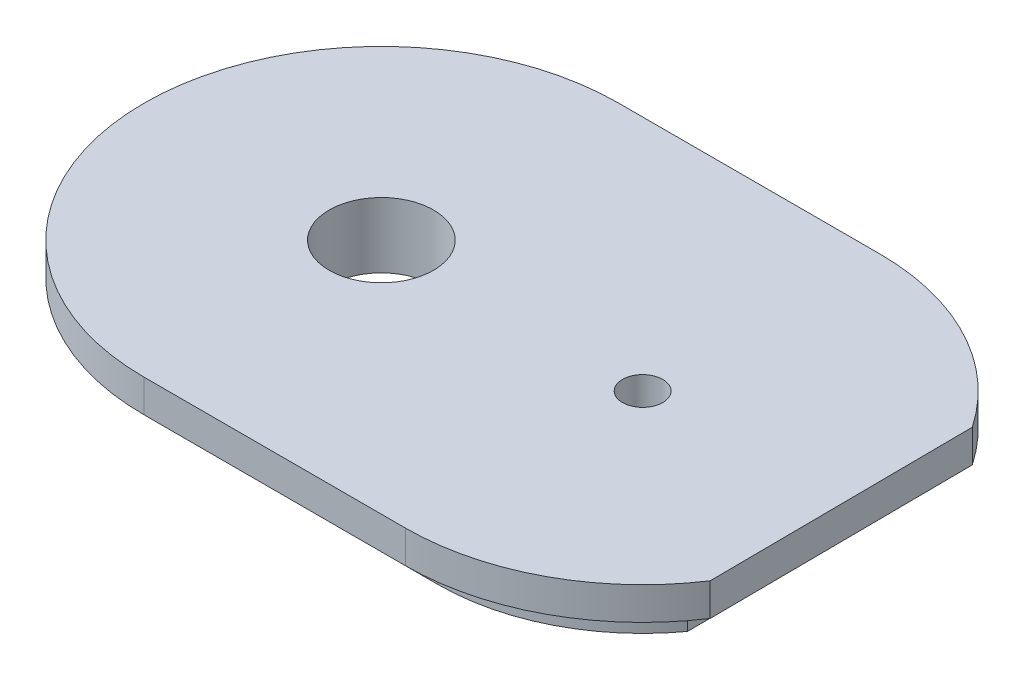
ISO-10303-21;
HEADER;
FILE_DESCRIPTION(('STEP AP214'),'2;1');
FILE_NAME('part.step','',(''),(''),'','','');
FILE_SCHEMA(('AUTOMOTIVE_DESIGN { 1 0 10303 214 1 1 1 1 }'));
ENDSEC;
DATA;
#1=APPLICATION_CONTEXT('core data for automotive mechanical design processes');
#2=APPLICATION_PROTOCOL_DEFINITION('international standard','automotive_design',2000,#1);
#3=PRODUCT_CONTEXT('',#1,'mechanical');
#4=PRODUCT('Part','Part','',(#3));
#5=PRODUCT_RELATED_PRODUCT_CATEGORY('part','',(#4));
#6=PRODUCT_DEFINITION_FORMATION('','',#4);
#7=PRODUCT_DEFINITION_CONTEXT('part definition',#1,'design');
#8=PRODUCT_DEFINITION('design','',#6,#7);
#9=PRODUCT_DEFINITION_SHAPE('','',#8);
#10=(LENGTH_UNIT() NAMED_UNIT(*) SI_UNIT(.MILLI.,.METRE.));
#11=(NAMED_UNIT(*) PLANE_ANGLE_UNIT() SI_UNIT($,.RADIAN.));
#12=(NAMED_UNIT(*) SI_UNIT($,.STERADIAN.) SOLID_ANGLE_UNIT());
#13=UNCERTAINTY_MEASURE_WITH_UNIT(LENGTH_MEASURE(1.E-05),#10,'distance_accuracy_value','');
#14=(GEOMETRIC_REPRESENTATION_CONTEXT(3) GLOBAL_UNCERTAINTY_ASSIGNED_CONTEXT((#13)) GLOBAL_UNIT_ASSIGNED_CONTEXT((#10,
#11,#12)) REPRESENTATION_CONTEXT('',''));
#15=CARTESIAN_POINT('',(0.,0.,0.));
#16=DIRECTION('',(0.,0.,1.));
#17=DIRECTION('',(1.,0.,0.));
#18=AXIS2_PLACEMENT_3D('',#15,#16,#17);
#19=CARTESIAN_POINT('',(-4.2390836204506,-1.25,-7.83579325082316));
#20=DIRECTION('',(0.,0.,-1.));
#21=DIRECTION('',(-1.,0.,0.));
#22=AXIS2_PLACEMENT_3D('',#19,#20,#21);
#23=PLANE('',#22);
#24=DIRECTION('',(-1.,0.,0.));
#25=VECTOR('',#24,1.);
#26=CARTESIAN_POINT('',(-4.2390836204506,0.,-7.83579325082316));
#27=LINE('',#26,#25);
#28=CARTESIAN_POINT('',(-4.2390836204506,0.,-7.83579325082316));
#29=VERTEX_POINT('',#28);
#30=CARTESIAN_POINT('',(-14.2421395949664,0.,-7.83579325082316));
#31=VERTEX_POINT('',#30);
#32=EDGE_CURVE('E202',#29,#31,#27,.T.);
#33=ORIENTED_EDGE('',*,*,#32,.F.);
#34=DIRECTION('',(0.,1.,0.));
#35=VECTOR('',#34,1.);
#36=CARTESIAN_POINT('',(-4.2390836204506,-1.25,-7.83579325082316));
#37=LINE('',#36,#35);
#38=CARTESIAN_POINT('',(-4.2390836204506,-1.25,-7.83579325082316));
#39=VERTEX_POINT('',#38);
#40=EDGE_CURVE('E12',#39,#29,#37,.T.);
#41=ORIENTED_EDGE('',*,*,#40,.F.);
#42=DIRECTION('',(-1.,0.,0.));
#43=VECTOR('',#42,1.);
#44=CARTESIAN_POINT('',(-4.2390836204506,-1.25,-7.83579325082316));
#45=LINE('',#44,#43);
#46=CARTESIAN_POINT('',(-14.2421395949664,-1.25,-7.83579325082316));
#47=VERTEX_POINT('',#46);
#48=EDGE_CURVE('E217',#39,#47,#45,.T.);
#49=ORIENTED_EDGE('',*,*,#48,.T.);
#50=DIRECTION('',(0.,1.,0.));
#51=VECTOR('',#50,1.);
#52=CARTESIAN_POINT('',(-14.2421395949664,-1.25,-7.83579325082316));
#53=LINE('',#52,#51);
#54=EDGE_CURVE('E120',#47,#31,#53,.T.);
#55=ORIENTED_EDGE('',*,*,#54,.T.);
#56=EDGE_LOOP('',(#33,#41,#49,#55));
#57=FACE_BOUND('',#56,.T.);
#58=ADVANCED_FACE('F117',(#57),#23,.T.);
#59=CARTESIAN_POINT('',(-4.2390836204506,-1.25,0.));
#60=DIRECTION('',(0.,1.,0.));
#61=DIRECTION('',(0.,0.,1.));
#62=AXIS2_PLACEMENT_3D('',#59,#60,#61);
#63=CYLINDRICAL_SURFACE('',#62,7.83579325082316);
#64=CARTESIAN_POINT('',(-4.2390836204506,0.,0.));
#65=DIRECTION('',(0.,1.,0.));
#66=DIRECTION('',(0.,0.,1.));
#67=AXIS2_PLACEMENT_3D('',#64,#65,#66);
#68=CIRCLE('',#67,7.83579325082316);
#69=CARTESIAN_POINT('',(2.02635285261106,0.,-4.70573710184435));
#70=VERTEX_POINT('',#69);
#71=EDGE_CURVE('E215',#70,#29,#68,.T.);
#72=ORIENTED_EDGE('',*,*,#71,.F.);
#73=DIRECTION('',(0.,1.,0.));
#74=VECTOR('',#73,1.);
#75=CARTESIAN_POINT('',(2.02635285261106,-1.25,-4.70573710184435));
#76=LINE('',#75,#74);
#77=CARTESIAN_POINT('',(2.02635285261106,-1.25,-4.70573710184435));
#78=VERTEX_POINT('',#77);
#79=EDGE_CURVE('E126',#78,#70,#76,.T.);
#80=ORIENTED_EDGE('',*,*,#79,.F.);
#81=CARTESIAN_POINT('',(-4.2390836204506,-1.25,0.));
#82=DIRECTION('',(0.,1.,0.));
#83=DIRECTION('',(0.,0.,1.));
#84=AXIS2_PLACEMENT_3D('',#81,#82,#83);
#85=CIRCLE('',#84,7.83579325082316);
#86=EDGE_CURVE('E192',#78,#39,#85,.T.);
#87=ORIENTED_EDGE('',*,*,#86,.T.);
#88=ORIENTED_EDGE('',*,*,#40,.T.);
#89=EDGE_LOOP('',(#72,#80,#87,#88));
#90=FACE_BOUND('',#89,.T.);
#91=ADVANCED_FACE('F228',(#90),#63,.T.);
#92=CARTESIAN_POINT('',(2.09434532245517,-1.25,4.61381985938));
#93=DIRECTION('',(0.999973387616815,0.,-0.00729548203689709));
#94=DIRECTION('',(-0.00729548203689709,0.,-0.999973387616815));
#95=AXIS2_PLACEMENT_3D('',#92,#93,#94);
#96=PLANE('',#95);
#97=DIRECTION('',(-0.00729548203689709,0.,-0.999973387616815));
#98=VECTOR('',#97,1.);
#99=CARTESIAN_POINT('',(2.09434532245517,0.,4.61381985938));
#100=LINE('',#99,#98);
#101=CARTESIAN_POINT('',(2.09434532245517,0.,4.61381985938));
#102=VERTEX_POINT('',#101);
#103=EDGE_CURVE('E181',#102,#70,#100,.T.);
#104=ORIENTED_EDGE('',*,*,#103,.F.);
#105=DIRECTION('',(0.,1.,0.));
#106=VECTOR('',#105,1.);
#107=CARTESIAN_POINT('',(2.09434532245517,-1.25,4.61381985938));
#108=LINE('',#107,#106);
#109=CARTESIAN_POINT('',(2.09434532245517,-1.25,4.61381985938));
#110=VERTEX_POINT('',#109);
#111=EDGE_CURVE('E155',#110,#102,#108,.T.);
#112=ORIENTED_EDGE('',*,*,#111,.F.);
#113=DIRECTION('',(-0.00729548203689709,0.,-0.999973387616815));
#114=VECTOR('',#113,1.);
#115=CARTESIAN_POINT('',(2.09434532245517,-1.25,4.61381985938));
#116=LINE('',#115,#114);
#117=EDGE_CURVE('E178',#110,#78,#116,.T.);
#118=ORIENTED_EDGE('',*,*,#117,.T.);
#119=ORIENTED_EDGE('',*,*,#79,.T.);
#120=EDGE_LOOP('',(#104,#112,#118,#119));
#121=FACE_BOUND('',#120,.T.);
#122=ADVANCED_FACE('F177',(#121),#96,.T.);
#123=CARTESIAN_POINT('',(-4.2390836204506,-1.25,0.));
#124=DIRECTION('',(0.,1.,0.));
#125=DIRECTION('',(0.,0.,1.));
#126=AXIS2_PLACEMENT_3D('',#123,#124,#125);
#127=CYLINDRICAL_SURFACE('',#126,7.83579325082316);
#128=CARTESIAN_POINT('',(-4.2390836204506,0.,0.));
#129=DIRECTION('',(0.,1.,0.));
#130=DIRECTION('',(0.,0.,1.));
#131=AXIS2_PLACEMENT_3D('',#128,#129,#130);
#132=CIRCLE('',#131,7.83579325082316);
#133=CARTESIAN_POINT('',(-4.2390836204506,0.,7.83579325082316));
#134=VERTEX_POINT('',#133);
#135=EDGE_CURVE('E212',#134,#102,#132,.T.);
#136=ORIENTED_EDGE('',*,*,#135,.F.);
#137=DIRECTION('',(0.,1.,0.));
#138=VECTOR('',#137,1.);
#139=CARTESIAN_POINT('',(-4.2390836204506,-1.25,7.83579325082316));
#140=LINE('',#139,#138);
#141=CARTESIAN_POINT('',(-4.2390836204506,-1.25,7.83579325082316));
#142=VERTEX_POINT('',#141);
#143=EDGE_CURVE('E183',#142,#134,#140,.T.);
#144=ORIENTED_EDGE('',*,*,#143,.F.);
#145=CARTESIAN_POINT('',(-4.2390836204506,-1.25,0.));
#146=DIRECTION('',(0.,1.,0.));
#147=DIRECTION('',(0.,0.,1.));
#148=AXIS2_PLACEMENT_3D('',#145,#146,#147);
#149=CIRCLE('',#148,7.83579325082316);
#150=EDGE_CURVE('E189',#142,#110,#149,.T.);
#151=ORIENTED_EDGE('',*,*,#150,.T.);
#152=ORIENTED_EDGE('',*,*,#111,.T.);
#153=EDGE_LOOP('',(#136,#144,#151,#152));
#154=FACE_BOUND('',#153,.T.);
#155=ADVANCED_FACE('F194',(#154),#127,.T.);
#156=CARTESIAN_POINT('',(-14.2421395949664,-1.25,7.83579325082316));
#157=DIRECTION('',(0.,0.,1.));
#158=DIRECTION('',(1.,0.,0.));
#159=AXIS2_PLACEMENT_3D('',#156,#157,#158);
#160=PLANE('',#159);
#161=DIRECTION('',(1.,0.,0.));
#162=VECTOR('',#161,1.);
#163=CARTESIAN_POINT('',(-14.2421395949664,0.,7.83579325082316));
#164=LINE('',#163,#162);
#165=CARTESIAN_POINT('',(-14.2421395949664,0.,7.83579325082316));
#166=VERTEX_POINT('',#165);
#167=EDGE_CURVE('E209',#166,#134,#164,.T.);
#168=ORIENTED_EDGE('',*,*,#167,.F.);
#169=DIRECTION('',(0.,1.,0.));
#170=VECTOR('',#169,1.);
#171=CARTESIAN_POINT('',(-14.2421395949664,-1.25,7.83579325082316));
#172=LINE('',#171,#170);
#173=CARTESIAN_POINT('',(-14.2421395949664,-1.25,7.83579325082316));
#174=VERTEX_POINT('',#173);
#175=EDGE_CURVE('E220',#174,#166,#172,.T.);
#176=ORIENTED_EDGE('',*,*,#175,.F.);
#177=DIRECTION('',(1.,0.,0.));
#178=VECTOR('',#177,1.);
#179=CARTESIAN_POINT('',(-14.2421395949664,-1.25,7.83579325082316));
#180=LINE('',#179,#178);
#181=EDGE_CURVE('E195',#174,#142,#180,.T.);
#182=ORIENTED_EDGE('',*,*,#181,.T.);
#183=ORIENTED_EDGE('',*,*,#143,.T.);
#184=EDGE_LOOP('',(#168,#176,#182,#183));
#185=FACE_BOUND('',#184,.T.);
#186=ADVANCED_FACE('F241',(#185),#160,.T.);
#187=CARTESIAN_POINT('',(-14.2421395949664,-1.25,0.));
#188=DIRECTION('',(0.,1.,0.));
#189=DIRECTION('',(0.,0.,1.));
#190=AXIS2_PLACEMENT_3D('',#187,#188,#189);
#191=CYLINDRICAL_SURFACE('',#190,7.83579325082316);
#192=CARTESIAN_POINT('',(-14.2421395949664,0.,0.));
#193=DIRECTION('',(0.,1.,0.));
#194=DIRECTION('',(0.,0.,1.));
#195=AXIS2_PLACEMENT_3D('',#192,#193,#194);
#196=CIRCLE('',#195,7.83579325082316);
#197=EDGE_CURVE('E205',#31,#166,#196,.T.);
#198=ORIENTED_EDGE('',*,*,#197,.F.);
#199=ORIENTED_EDGE('',*,*,#54,.F.);
#200=CARTESIAN_POINT('',(-14.2421395949664,-1.25,0.));
#201=DIRECTION('',(0.,1.,0.));
#202=DIRECTION('',(0.,0.,1.));
#203=AXIS2_PLACEMENT_3D('',#200,#201,#202);
#204=CIRCLE('',#203,7.83579325082316);
#205=EDGE_CURVE('E197',#47,#174,#204,.T.);
#206=ORIENTED_EDGE('',*,*,#205,.T.);
#207=ORIENTED_EDGE('',*,*,#175,.T.);
#208=EDGE_LOOP('',(#198,#199,#206,#207));
#209=FACE_BOUND('',#208,.T.);
#210=ADVANCED_FACE('F222',(#209),#191,.T.);
#211=CARTESIAN_POINT('',(-14.2421395949664,-1.25,0.));
#212=DIRECTION('',(0.,1.,0.));
#213=DIRECTION('',(0.,0.,1.));
#214=AXIS2_PLACEMENT_3D('',#211,#212,#213);
#215=PLANE('',#214);
#216=CARTESIAN_POINT('',(-4.2390836204506,-1.25,0.));
#217=DIRECTION('',(0.,1.,0.));
#218=DIRECTION('',(0.,0.,1.));
#219=AXIS2_PLACEMENT_3D('',#216,#217,#218);
#220=CIRCLE('',#219,0.77);
#221=CARTESIAN_POINT('',(-4.2390836204506,-1.25,0.77));
#222=VERTEX_POINT('',#221);
#223=EDGE_CURVE('E258',#222,#222,#220,.T.);
#224=ORIENTED_EDGE('',*,*,#223,.T.);
#225=EDGE_LOOP('',(#224));
#226=FACE_BOUND('',#225,.T.);
#227=CARTESIAN_POINT('',(-14.2421395949664,-1.25,0.));
#228=DIRECTION('',(0.,1.,0.));
#229=DIRECTION('',(0.,0.,1.));
#230=AXIS2_PLACEMENT_3D('',#227,#228,#229);
#231=CIRCLE('',#230,2.);
#232=CARTESIAN_POINT('',(-14.2421395949664,-1.25,2.));
#233=VERTEX_POINT('',#232);
#234=EDGE_CURVE('E206',#233,#233,#231,.T.);
#235=ORIENTED_EDGE('',*,*,#234,.T.);
#236=EDGE_LOOP('',(#235));
#237=FACE_BOUND('',#236,.T.);
#238=ORIENTED_EDGE('',*,*,#48,.F.);
#239=ORIENTED_EDGE('',*,*,#86,.F.);
#240=ORIENTED_EDGE('',*,*,#117,.F.);
#241=ORIENTED_EDGE('',*,*,#150,.F.);
#242=ORIENTED_EDGE('',*,*,#181,.F.);
#243=ORIENTED_EDGE('',*,*,#205,.F.);
#244=EDGE_LOOP('',(#238,#239,#240,#241,#242,#243));
#245=FACE_BOUND('',#244,.T.);
#246=ADVANCED_FACE('F187',(#226,#237,#245),#215,.F.);
#247=CARTESIAN_POINT('',(-14.2421395949664,-1.25,0.));
#248=DIRECTION('',(0.,1.,0.));
#249=DIRECTION('',(0.,0.,1.));
#250=AXIS2_PLACEMENT_3D('',#247,#248,#249);
#251=CYLINDRICAL_SURFACE('',#250,2.);
#252=ORIENTED_EDGE('',*,*,#234,.F.);
#253=EDGE_LOOP('',(#252));
#254=FACE_BOUND('',#253,.T.);
#255=CARTESIAN_POINT('',(-14.2421395949664,1.25,0.));
#256=DIRECTION('',(0.,1.,0.));
#257=DIRECTION('',(0.,0.,1.));
#258=AXIS2_PLACEMENT_3D('',#255,#256,#257);
#259=CIRCLE('',#258,2.);
#260=CARTESIAN_POINT('',(-14.2421395949664,1.25,2.));
#261=VERTEX_POINT('',#260);
#262=EDGE_CURVE('E303',#261,#261,#259,.T.);
#263=ORIENTED_EDGE('',*,*,#262,.T.);
#264=EDGE_LOOP('',(#263));
#265=FACE_BOUND('',#264,.T.);
#266=ADVANCED_FACE('F248',(#254,#265),#251,.F.);
#267=CARTESIAN_POINT('',(-4.2390836204506,-1.25,0.));
#268=DIRECTION('',(0.,1.,0.));
#269=DIRECTION('',(0.,0.,1.));
#270=AXIS2_PLACEMENT_3D('',#267,#268,#269);
#271=CYLINDRICAL_SURFACE('',#270,0.77);
#272=ORIENTED_EDGE('',*,*,#223,.F.);
#273=EDGE_LOOP('',(#272));
#274=FACE_BOUND('',#273,.T.);
#275=CARTESIAN_POINT('',(-4.2390836204506,1.25,0.));
#276=DIRECTION('',(0.,1.,0.));
#277=DIRECTION('',(0.,0.,1.));
#278=AXIS2_PLACEMENT_3D('',#275,#276,#277);
#279=CIRCLE('',#278,0.77);
#280=CARTESIAN_POINT('',(-4.2390836204506,1.25,0.77));
#281=VERTEX_POINT('',#280);
#282=EDGE_CURVE('E322',#281,#281,#279,.T.);
#283=ORIENTED_EDGE('',*,*,#282,.T.);
#284=EDGE_LOOP('',(#283));
#285=FACE_BOUND('',#284,.T.);
#286=ADVANCED_FACE('F253',(#274,#285),#271,.F.);
#287=CARTESIAN_POINT('',(-4.2390836204506,1.25,0.));
#288=DIRECTION('',(0.,1.,0.));
#289=DIRECTION('',(0.,0.,1.));
#290=AXIS2_PLACEMENT_3D('',#287,#288,#289);
#291=PLANE('',#290);
#292=ORIENTED_EDGE('',*,*,#262,.F.);
#293=EDGE_LOOP('',(#292));
#294=FACE_BOUND('',#293,.T.);
#295=CARTESIAN_POINT('',(-4.2390836204506,1.25,0.));
#296=DIRECTION('',(0.,1.,0.));
#297=DIRECTION('',(0.,0.,1.));
#298=AXIS2_PLACEMENT_3D('',#295,#296,#297);
#299=CIRCLE('',#298,9.08579325082316);
#300=CARTESIAN_POINT('',(3.27343561003098,1.25,-5.11015594755659));
#301=VERTEX_POINT('',#300);
#302=CARTESIAN_POINT('',(-4.2390836204506,1.25,-9.08579325082316));
#303=VERTEX_POINT('',#302);
#304=EDGE_CURVE('E287',#301,#303,#299,.T.);
#305=ORIENTED_EDGE('',*,*,#304,.T.);
#306=DIRECTION('',(-1.,0.,0.));
#307=VECTOR('',#306,1.);
#308=CARTESIAN_POINT('',(-4.2390836204506,1.25,-9.08579325082316));
#309=LINE('',#308,#307);
#310=CARTESIAN_POINT('',(-14.2421395949664,1.25,-9.08579325082315));
#311=VERTEX_POINT('',#310);
#312=EDGE_CURVE('E315',#303,#311,#309,.T.);
#313=ORIENTED_EDGE('',*,*,#312,.T.);
#314=CARTESIAN_POINT('',(-14.2421395949664,1.25,0.));
#315=DIRECTION('',(0.,1.,0.));
#316=DIRECTION('',(0.,0.,1.));
#317=AXIS2_PLACEMENT_3D('',#314,#315,#316);
#318=CIRCLE('',#317,9.08579325082316);
#319=CARTESIAN_POINT('',(-14.2421395949664,1.25,9.08579325082316));
#320=VERTEX_POINT('',#319);
#321=EDGE_CURVE('E312',#311,#320,#318,.T.);
#322=ORIENTED_EDGE('',*,*,#321,.T.);
#323=DIRECTION('',(1.,0.,0.));
#324=VECTOR('',#323,1.);
#325=CARTESIAN_POINT('',(-14.2421395949664,1.25,9.08579325082316));
#326=LINE('',#325,#324);
#327=CARTESIAN_POINT('',(-4.2390836204506,1.25,9.08579325082316));
#328=VERTEX_POINT('',#327);
#329=EDGE_CURVE('E309',#320,#328,#326,.T.);
#330=ORIENTED_EDGE('',*,*,#329,.T.);
#331=CARTESIAN_POINT('',(-4.2390836204506,1.25,0.));
#332=DIRECTION('',(0.,1.,0.));
#333=DIRECTION('',(0.,0.,1.));
#334=AXIS2_PLACEMENT_3D('',#331,#332,#333);
#335=CIRCLE('',#334,9.08579325082316);
#336=CARTESIAN_POINT('',(3.34719603407727,1.25,5.00000000000001));
#337=VERTEX_POINT('',#336);
#338=EDGE_CURVE('E306',#328,#337,#335,.T.);
#339=ORIENTED_EDGE('',*,*,#338,.T.);
#340=DIRECTION('',(0.00729548203689677,0.,0.999973387616815));
#341=VECTOR('',#340,1.);
#342=CARTESIAN_POINT('',(3.27343561003098,1.25,-5.11015594755659));
#343=LINE('',#342,#341);
#344=EDGE_CURVE('E283',#301,#337,#343,.T.);
#345=ORIENTED_EDGE('',*,*,#344,.F.);
#346=EDGE_LOOP('',(#305,#313,#322,#330,#339,#345));
#347=FACE_BOUND('',#346,.T.);
#348=ORIENTED_EDGE('',*,*,#282,.F.);
#349=EDGE_LOOP('',(#348));
#350=FACE_BOUND('',#349,.T.);
#351=ADVANCED_FACE('F327',(#294,#347,#350),#291,.T.);
#352=CARTESIAN_POINT('',(-4.2390836204506,0.,0.));
#353=DIRECTION('',(0.,1.,0.));
#354=DIRECTION('',(0.,0.,1.));
#355=AXIS2_PLACEMENT_3D('',#352,#353,#354);
#356=PLANE('',#355);
#357=ORIENTED_EDGE('',*,*,#71,.T.);
#358=ORIENTED_EDGE('',*,*,#32,.T.);
#359=ORIENTED_EDGE('',*,*,#197,.T.);
#360=ORIENTED_EDGE('',*,*,#167,.T.);
#361=ORIENTED_EDGE('',*,*,#135,.T.);
#362=ORIENTED_EDGE('',*,*,#103,.T.);
#363=EDGE_LOOP('',(#357,#358,#359,#360,#361,#362));
#364=FACE_BOUND('',#363,.T.);
#365=CARTESIAN_POINT('',(-4.2390836204506,0.,0.));
#366=DIRECTION('',(0.,1.,0.));
#367=DIRECTION('',(0.,0.,1.));
#368=AXIS2_PLACEMENT_3D('',#365,#366,#367);
#369=CIRCLE('',#368,9.08579325082316);
#370=CARTESIAN_POINT('',(3.27343561003098,0.,-5.11015594755659));
#371=VERTEX_POINT('',#370);
#372=CARTESIAN_POINT('',(-4.2390836204506,0.,-9.08579325082316));
#373=VERTEX_POINT('',#372);
#374=EDGE_CURVE('E300',#371,#373,#369,.T.);
#375=ORIENTED_EDGE('',*,*,#374,.F.);
#376=DIRECTION('',(0.00729548203689677,0.,0.999973387616815));
#377=VECTOR('',#376,1.);
#378=CARTESIAN_POINT('',(3.27343561003098,0.,-5.11015594755659));
#379=LINE('',#378,#377);
#380=CARTESIAN_POINT('',(3.34719603407727,0.,5.00000000000001));
#381=VERTEX_POINT('',#380);
#382=EDGE_CURVE('E284',#371,#381,#379,.T.);
#383=ORIENTED_EDGE('',*,*,#382,.T.);
#384=CARTESIAN_POINT('',(-4.2390836204506,0.,0.));
#385=DIRECTION('',(0.,1.,0.));
#386=DIRECTION('',(0.,0.,1.));
#387=AXIS2_PLACEMENT_3D('',#384,#385,#386);
#388=CIRCLE('',#387,9.08579325082316);
#389=CARTESIAN_POINT('',(-4.2390836204506,0.,9.08579325082316));
#390=VERTEX_POINT('',#389);
#391=EDGE_CURVE('E288',#390,#381,#388,.T.);
#392=ORIENTED_EDGE('',*,*,#391,.F.);
#393=DIRECTION('',(1.,0.,0.));
#394=VECTOR('',#393,1.);
#395=CARTESIAN_POINT('',(-14.2421395949664,0.,9.08579325082316));
#396=LINE('',#395,#394);
#397=CARTESIAN_POINT('',(-14.2421395949664,0.,9.08579325082316));
#398=VERTEX_POINT('',#397);
#399=EDGE_CURVE('E291',#398,#390,#396,.T.);
#400=ORIENTED_EDGE('',*,*,#399,.F.);
#401=CARTESIAN_POINT('',(-14.2421395949664,0.,0.));
#402=DIRECTION('',(0.,1.,0.));
#403=DIRECTION('',(0.,0.,1.));
#404=AXIS2_PLACEMENT_3D('',#401,#402,#403);
#405=CIRCLE('',#404,9.08579325082316);
#406=CARTESIAN_POINT('',(-14.2421395949664,0.,-9.08579325082315));
#407=VERTEX_POINT('',#406);
#408=EDGE_CURVE('E294',#407,#398,#405,.T.);
#409=ORIENTED_EDGE('',*,*,#408,.F.);
#410=DIRECTION('',(-1.,0.,0.));
#411=VECTOR('',#410,1.);
#412=CARTESIAN_POINT('',(-4.2390836204506,0.,-9.08579325082316));
#413=LINE('',#412,#411);
#414=EDGE_CURVE('E297',#373,#407,#413,.T.);
#415=ORIENTED_EDGE('',*,*,#414,.F.);
#416=EDGE_LOOP('',(#375,#383,#392,#400,#409,#415));
#417=FACE_BOUND('',#416,.T.);
#418=ADVANCED_FACE('F224',(#364,#417),#356,.F.);
#419=CARTESIAN_POINT('',(-4.2390836204506,1.25,0.));
#420=DIRECTION('',(0.,-1.,0.));
#421=DIRECTION('',(0.,0.,-1.));
#422=AXIS2_PLACEMENT_3D('',#419,#420,#421);
#423=CYLINDRICAL_SURFACE('',#422,9.08579325082316);
#424=ORIENTED_EDGE('',*,*,#374,.T.);
#425=DIRECTION('',(0.,-1.,0.));
#426=VECTOR('',#425,1.);
#427=CARTESIAN_POINT('',(-4.2390836204506,1.25,-9.08579325082316));
#428=LINE('',#427,#426);
#429=EDGE_CURVE('E262',#303,#373,#428,.T.);
#430=ORIENTED_EDGE('',*,*,#429,.F.);
#431=ORIENTED_EDGE('',*,*,#304,.F.);
#432=DIRECTION('',(0.,-1.,0.));
#433=VECTOR('',#432,1.);
#434=CARTESIAN_POINT('',(3.27343561003098,1.25,-5.11015594755659));
#435=LINE('',#434,#433);
#436=EDGE_CURVE('E280',#301,#371,#435,.T.);
#437=ORIENTED_EDGE('',*,*,#436,.T.);
#438=EDGE_LOOP('',(#424,#430,#431,#437));
#439=FACE_BOUND('',#438,.T.);
#440=ADVANCED_FACE('F335',(#439),#423,.T.);
#441=CARTESIAN_POINT('',(-4.2390836204506,1.25,-9.08579325082316));
#442=DIRECTION('',(0.,0.,1.));
#443=DIRECTION('',(1.,0.,0.));
#444=AXIS2_PLACEMENT_3D('',#441,#442,#443);
#445=PLANE('',#444);
#446=ORIENTED_EDGE('',*,*,#414,.T.);
#447=DIRECTION('',(0.,-1.,0.));
#448=VECTOR('',#447,1.);
#449=CARTESIAN_POINT('',(-14.2421395949664,1.25,-9.08579325082315));
#450=LINE('',#449,#448);
#451=EDGE_CURVE('E268',#311,#407,#450,.T.);
#452=ORIENTED_EDGE('',*,*,#451,.F.);
#453=ORIENTED_EDGE('',*,*,#312,.F.);
#454=ORIENTED_EDGE('',*,*,#429,.T.);
#455=EDGE_LOOP('',(#446,#452,#453,#454));
#456=FACE_BOUND('',#455,.T.);
#457=ADVANCED_FACE('F357',(#456),#445,.F.);
#458=CARTESIAN_POINT('',(-14.2421395949664,1.25,0.));
#459=DIRECTION('',(0.,-1.,0.));
#460=DIRECTION('',(0.,0.,-1.));
#461=AXIS2_PLACEMENT_3D('',#458,#459,#460);
#462=CYLINDRICAL_SURFACE('',#461,9.08579325082316);
#463=ORIENTED_EDGE('',*,*,#408,.T.);
#464=DIRECTION('',(0.,-1.,0.));
#465=VECTOR('',#464,1.);
#466=CARTESIAN_POINT('',(-14.2421395949664,1.25,9.08579325082316));
#467=LINE('',#466,#465);
#468=EDGE_CURVE('E271',#320,#398,#467,.T.);
#469=ORIENTED_EDGE('',*,*,#468,.F.);
#470=ORIENTED_EDGE('',*,*,#321,.F.);
#471=ORIENTED_EDGE('',*,*,#451,.T.);
#472=EDGE_LOOP('',(#463,#469,#470,#471));
#473=FACE_BOUND('',#472,.T.);
#474=ADVANCED_FACE('F353',(#473),#462,.T.);
#475=CARTESIAN_POINT('',(-14.2421395949664,1.25,9.08579325082316));
#476=DIRECTION('',(0.,0.,-1.));
#477=DIRECTION('',(-1.,0.,0.));
#478=AXIS2_PLACEMENT_3D('',#475,#476,#477);
#479=PLANE('',#478);
#480=ORIENTED_EDGE('',*,*,#399,.T.);
#481=DIRECTION('',(0.,-1.,0.));
#482=VECTOR('',#481,1.);
#483=CARTESIAN_POINT('',(-4.2390836204506,1.25,9.08579325082316));
#484=LINE('',#483,#482);
#485=EDGE_CURVE('E274',#328,#390,#484,.T.);
#486=ORIENTED_EDGE('',*,*,#485,.F.);
#487=ORIENTED_EDGE('',*,*,#329,.F.);
#488=ORIENTED_EDGE('',*,*,#468,.T.);
#489=EDGE_LOOP('',(#480,#486,#487,#488));
#490=FACE_BOUND('',#489,.T.);
#491=ADVANCED_FACE('F349',(#490),#479,.F.);
#492=CARTESIAN_POINT('',(-4.2390836204506,1.25,0.));
#493=DIRECTION('',(0.,-1.,0.));
#494=DIRECTION('',(0.,0.,-1.));
#495=AXIS2_PLACEMENT_3D('',#492,#493,#494);
#496=CYLINDRICAL_SURFACE('',#495,9.08579325082316);
#497=ORIENTED_EDGE('',*,*,#391,.T.);
#498=DIRECTION('',(0.,-1.,0.));
#499=VECTOR('',#498,1.);
#500=CARTESIAN_POINT('',(3.34719603407727,1.25,5.00000000000001));
#501=LINE('',#500,#499);
#502=EDGE_CURVE('E277',#337,#381,#501,.T.);
#503=ORIENTED_EDGE('',*,*,#502,.F.);
#504=ORIENTED_EDGE('',*,*,#338,.F.);
#505=ORIENTED_EDGE('',*,*,#485,.T.);
#506=EDGE_LOOP('',(#497,#503,#504,#505));
#507=FACE_BOUND('',#506,.T.);
#508=ADVANCED_FACE('F345',(#507),#496,.T.);
#509=CARTESIAN_POINT('',(3.27343561003098,1.25,-5.11015594755659));
#510=DIRECTION('',(0.999973387616815,0.,-0.00729548203689677));
#511=DIRECTION('',(-0.00729548203689677,0.,-0.999973387616815));
#512=AXIS2_PLACEMENT_3D('',#509,#510,#511);
#513=PLANE('',#512);
#514=ORIENTED_EDGE('',*,*,#382,.F.);
#515=ORIENTED_EDGE('',*,*,#436,.F.);
#516=ORIENTED_EDGE('',*,*,#344,.T.);
#517=ORIENTED_EDGE('',*,*,#502,.T.);
#518=EDGE_LOOP('',(#514,#515,#516,#517));
#519=FACE_BOUND('',#518,.T.);
#520=ADVANCED_FACE('F342',(#519),#513,.T.);
#521=CLOSED_SHELL('',(#58,#91,#122,#155,#186,#210,#246,#266,#286,#351,#418,#440,#457,#474,#491,
#508,#520));
#522=MANIFOLD_SOLID_BREP('B2',#521);
#523=ADVANCED_BREP_SHAPE_REPRESENTATION('',(#18,#522),#14);
#524=SHAPE_DEFINITION_REPRESENTATION(#9,#523);
ENDSEC;
END-ISO-10303-21;
